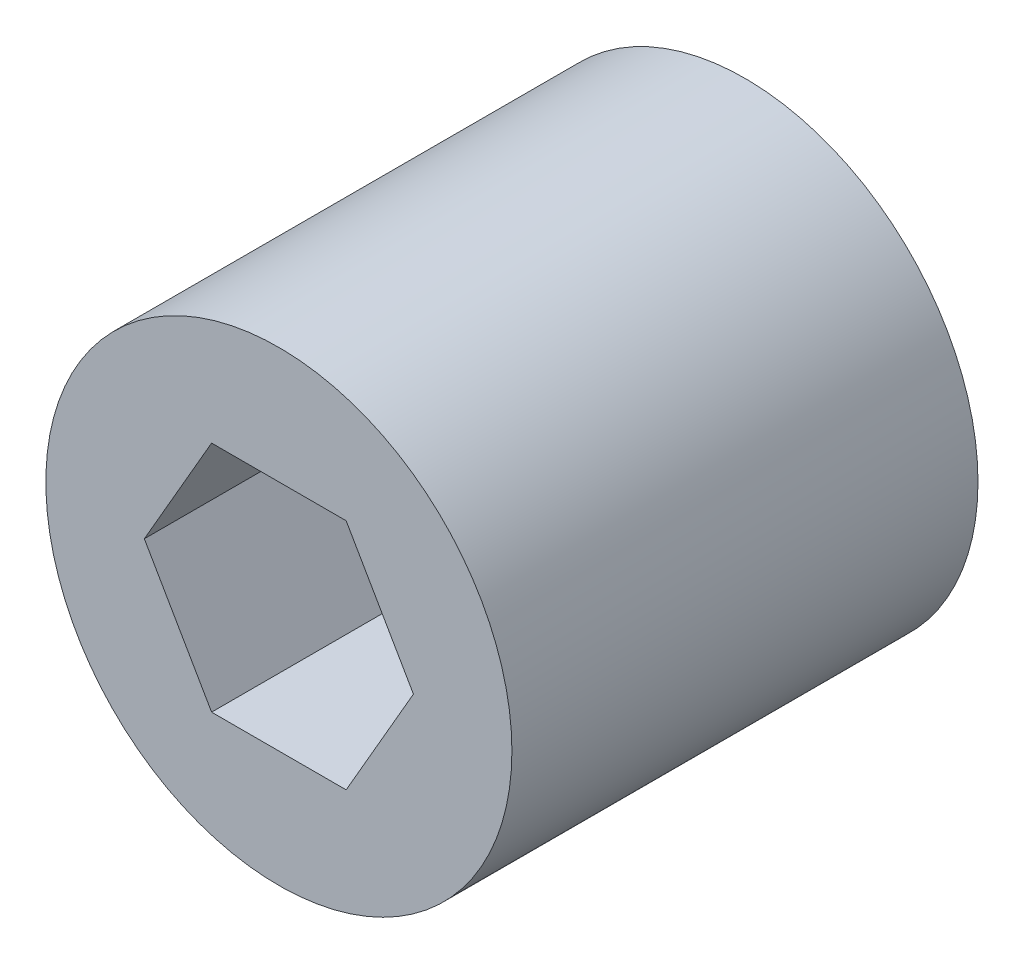
ISO-10303-21;
HEADER;
FILE_DESCRIPTION(('STEP AP214'),'2;1');
FILE_NAME('part.step','',(''),(''),'','','');
FILE_SCHEMA(('AUTOMOTIVE_DESIGN { 1 0 10303 214 1 1 1 1 }'));
ENDSEC;
DATA;
#1=APPLICATION_CONTEXT('core data for automotive mechanical design processes');
#2=APPLICATION_PROTOCOL_DEFINITION('international standard','automotive_design',2000,#1);
#3=PRODUCT_CONTEXT('',#1,'mechanical');
#4=PRODUCT('Part','Part','',(#3));
#5=PRODUCT_RELATED_PRODUCT_CATEGORY('part','',(#4));
#6=PRODUCT_DEFINITION_FORMATION('','',#4);
#7=PRODUCT_DEFINITION_CONTEXT('part definition',#1,'design');
#8=PRODUCT_DEFINITION('design','',#6,#7);
#9=PRODUCT_DEFINITION_SHAPE('','',#8);
#10=(LENGTH_UNIT() NAMED_UNIT(*) SI_UNIT(.MILLI.,.METRE.));
#11=(NAMED_UNIT(*) PLANE_ANGLE_UNIT() SI_UNIT($,.RADIAN.));
#12=(NAMED_UNIT(*) SI_UNIT($,.STERADIAN.) SOLID_ANGLE_UNIT());
#13=UNCERTAINTY_MEASURE_WITH_UNIT(LENGTH_MEASURE(1.E-05),#10,'distance_accuracy_value','');
#14=(GEOMETRIC_REPRESENTATION_CONTEXT(3) GLOBAL_UNCERTAINTY_ASSIGNED_CONTEXT((#13)) GLOBAL_UNIT_ASSIGNED_CONTEXT((#10,
#11,#12)) REPRESENTATION_CONTEXT('',''));
#15=CARTESIAN_POINT('',(0.,0.,0.));
#16=DIRECTION('',(0.,0.,1.));
#17=DIRECTION('',(1.,0.,0.));
#18=AXIS2_PLACEMENT_3D('',#15,#16,#17);
#19=CARTESIAN_POINT('',(0.,0.,4.));
#20=DIRECTION('',(0.,0.,1.));
#21=DIRECTION('',(1.,0.,0.));
#22=AXIS2_PLACEMENT_3D('',#19,#20,#21);
#23=PLANE('',#22);
#24=CARTESIAN_POINT('',(0.,0.,4.));
#25=DIRECTION('',(0.,0.,1.));
#26=DIRECTION('',(1.,0.,0.));
#27=AXIS2_PLACEMENT_3D('',#24,#25,#26);
#28=CIRCLE('',#27,1.5);
#29=CARTESIAN_POINT('',(1.5,0.,4.));
#30=VERTEX_POINT('',#29);
#31=EDGE_CURVE('E100',#30,#30,#28,.T.);
#32=ORIENTED_EDGE('',*,*,#31,.T.);
#33=EDGE_LOOP('',(#32));
#34=FACE_BOUND('',#33,.T.);
#35=DIRECTION('',(0.5,-0.866025403784439,0.));
#36=VECTOR('',#35,1.);
#37=CARTESIAN_POINT('',(0.649519052838329,0.375,4.));
#38=LINE('',#37,#36);
#39=CARTESIAN_POINT('',(0.433012701892219,0.75,4.));
#40=VERTEX_POINT('',#39);
#41=CARTESIAN_POINT('',(0.866025403784439,0.,4.));
#42=VERTEX_POINT('',#41);
#43=EDGE_CURVE('E48',#40,#42,#38,.T.);
#44=ORIENTED_EDGE('',*,*,#43,.T.);
#45=DIRECTION('',(-0.5,-0.866025403784439,0.));
#46=VECTOR('',#45,1.);
#47=CARTESIAN_POINT('',(0.649519052838329,-0.375,4.));
#48=LINE('',#47,#46);
#49=CARTESIAN_POINT('',(0.433012701892219,-0.75,4.));
#50=VERTEX_POINT('',#49);
#51=EDGE_CURVE('E11',#42,#50,#48,.T.);
#52=ORIENTED_EDGE('',*,*,#51,.T.);
#53=DIRECTION('',(-1.,0.,0.));
#54=VECTOR('',#53,1.);
#55=CARTESIAN_POINT('',(0.,-0.75,4.));
#56=LINE('',#55,#54);
#57=CARTESIAN_POINT('',(-0.43301270189222,-0.75,4.));
#58=VERTEX_POINT('',#57);
#59=EDGE_CURVE('E135',#50,#58,#56,.T.);
#60=ORIENTED_EDGE('',*,*,#59,.T.);
#61=DIRECTION('',(-0.5,0.866025403784439,0.));
#62=VECTOR('',#61,1.);
#63=CARTESIAN_POINT('',(-0.649519052838329,-0.375,4.));
#64=LINE('',#63,#62);
#65=CARTESIAN_POINT('',(-0.866025403784439,0.,4.));
#66=VERTEX_POINT('',#65);
#67=EDGE_CURVE('E138',#58,#66,#64,.T.);
#68=ORIENTED_EDGE('',*,*,#67,.T.);
#69=DIRECTION('',(0.5,0.866025403784439,0.));
#70=VECTOR('',#69,1.);
#71=CARTESIAN_POINT('',(-0.649519052838329,0.375,4.));
#72=LINE('',#71,#70);
#73=CARTESIAN_POINT('',(-0.433012701892219,0.75,4.));
#74=VERTEX_POINT('',#73);
#75=EDGE_CURVE('E140',#66,#74,#72,.T.);
#76=ORIENTED_EDGE('',*,*,#75,.T.);
#77=DIRECTION('',(1.,0.,0.));
#78=VECTOR('',#77,1.);
#79=CARTESIAN_POINT('',(0.,0.75,4.));
#80=LINE('',#79,#78);
#81=EDGE_CURVE('E142',#74,#40,#80,.T.);
#82=ORIENTED_EDGE('',*,*,#81,.T.);
#83=EDGE_LOOP('',(#44,#52,#60,#68,#76,#82));
#84=FACE_BOUND('',#83,.T.);
#85=ADVANCED_FACE('F39',(#34,#84),#23,.T.);
#86=CARTESIAN_POINT('',(0.,0.,4.));
#87=DIRECTION('',(0.,0.,-1.));
#88=DIRECTION('',(-1.,0.,0.));
#89=AXIS2_PLACEMENT_3D('',#86,#87,#88);
#90=CYLINDRICAL_SURFACE('',#89,1.5);
#91=CARTESIAN_POINT('',(0.,0.,1.));
#92=DIRECTION('',(0.,0.,1.));
#93=DIRECTION('',(1.,0.,0.));
#94=AXIS2_PLACEMENT_3D('',#91,#92,#93);
#95=CIRCLE('',#94,1.5);
#96=CARTESIAN_POINT('',(1.5,0.,1.));
#97=VERTEX_POINT('',#96);
#98=EDGE_CURVE('E43',#97,#97,#95,.T.);
#99=ORIENTED_EDGE('',*,*,#98,.T.);
#100=EDGE_LOOP('',(#99));
#101=FACE_BOUND('',#100,.T.);
#102=ORIENTED_EDGE('',*,*,#31,.F.);
#103=EDGE_LOOP('',(#102));
#104=FACE_BOUND('',#103,.T.);
#105=ADVANCED_FACE('F41',(#101,#104),#90,.T.);
#106=CARTESIAN_POINT('',(0.433012701892219,-0.75,4.1));
#107=DIRECTION('',(-0.866025403784439,0.5,0.));
#108=DIRECTION('',(-0.5,-0.866025403784439,0.));
#109=AXIS2_PLACEMENT_3D('',#106,#107,#108);
#110=PLANE('',#109);
#111=DIRECTION('',(0.,0.,-1.));
#112=VECTOR('',#111,1.);
#113=CARTESIAN_POINT('',(0.866025403784439,0.,4.1));
#114=LINE('',#113,#112);
#115=CARTESIAN_POINT('',(0.866025403784439,0.,2.8));
#116=VERTEX_POINT('',#115);
#117=EDGE_CURVE('E89',#42,#116,#114,.T.);
#118=ORIENTED_EDGE('',*,*,#117,.T.);
#119=DIRECTION('',(0.5,0.866025403784439,0.));
#120=VECTOR('',#119,1.);
#121=CARTESIAN_POINT('',(0.433012701892219,-0.75,2.8));
#122=LINE('',#121,#120);
#123=CARTESIAN_POINT('',(0.433012701892219,-0.75,2.8));
#124=VERTEX_POINT('',#123);
#125=EDGE_CURVE('E94',#124,#116,#122,.T.);
#126=ORIENTED_EDGE('',*,*,#125,.F.);
#127=DIRECTION('',(0.,0.,-1.));
#128=VECTOR('',#127,1.);
#129=CARTESIAN_POINT('',(0.433012701892219,-0.75,4.1));
#130=LINE('',#129,#128);
#131=EDGE_CURVE('E122',#50,#124,#130,.T.);
#132=ORIENTED_EDGE('',*,*,#131,.F.);
#133=ORIENTED_EDGE('',*,*,#51,.F.);
#134=EDGE_LOOP('',(#118,#126,#132,#133));
#135=FACE_BOUND('',#134,.T.);
#136=ADVANCED_FACE('F95',(#135),#110,.T.);
#137=CARTESIAN_POINT('',(0.866025403784439,0.,4.1));
#138=DIRECTION('',(-0.866025403784439,-0.5,0.));
#139=DIRECTION('',(0.5,-0.866025403784439,0.));
#140=AXIS2_PLACEMENT_3D('',#137,#138,#139);
#141=PLANE('',#140);
#142=DIRECTION('',(0.,0.,-1.));
#143=VECTOR('',#142,1.);
#144=CARTESIAN_POINT('',(0.433012701892219,0.75,4.1));
#145=LINE('',#144,#143);
#146=CARTESIAN_POINT('',(0.433012701892219,0.75,2.8));
#147=VERTEX_POINT('',#146);
#148=EDGE_CURVE('E98',#40,#147,#145,.T.);
#149=ORIENTED_EDGE('',*,*,#148,.T.);
#150=DIRECTION('',(-0.5,0.866025403784439,0.));
#151=VECTOR('',#150,1.);
#152=CARTESIAN_POINT('',(0.866025403784439,0.,2.8));
#153=LINE('',#152,#151);
#154=EDGE_CURVE('E101',#116,#147,#153,.T.);
#155=ORIENTED_EDGE('',*,*,#154,.F.);
#156=ORIENTED_EDGE('',*,*,#117,.F.);
#157=ORIENTED_EDGE('',*,*,#43,.F.);
#158=EDGE_LOOP('',(#149,#155,#156,#157));
#159=FACE_BOUND('',#158,.T.);
#160=ADVANCED_FACE('F105',(#159),#141,.T.);
#161=CARTESIAN_POINT('',(0.433012701892219,0.75,4.1));
#162=DIRECTION('',(0.,-1.,0.));
#163=DIRECTION('',(1.,0.,0.));
#164=AXIS2_PLACEMENT_3D('',#161,#162,#163);
#165=PLANE('',#164);
#166=DIRECTION('',(0.,0.,-1.));
#167=VECTOR('',#166,1.);
#168=CARTESIAN_POINT('',(-0.433012701892219,0.75,4.1));
#169=LINE('',#168,#167);
#170=CARTESIAN_POINT('',(-0.433012701892219,0.75,2.8));
#171=VERTEX_POINT('',#170);
#172=EDGE_CURVE('E126',#74,#171,#169,.T.);
#173=ORIENTED_EDGE('',*,*,#172,.T.);
#174=DIRECTION('',(-1.,0.,0.));
#175=VECTOR('',#174,1.);
#176=CARTESIAN_POINT('',(0.433012701892219,0.75,2.8));
#177=LINE('',#176,#175);
#178=EDGE_CURVE('E110',#147,#171,#177,.T.);
#179=ORIENTED_EDGE('',*,*,#178,.F.);
#180=ORIENTED_EDGE('',*,*,#148,.F.);
#181=ORIENTED_EDGE('',*,*,#81,.F.);
#182=EDGE_LOOP('',(#173,#179,#180,#181));
#183=FACE_BOUND('',#182,.T.);
#184=ADVANCED_FACE('F150',(#183),#165,.T.);
#185=CARTESIAN_POINT('',(-0.433012701892219,0.75,4.1));
#186=DIRECTION('',(0.866025403784439,-0.5,0.));
#187=DIRECTION('',(0.5,0.866025403784439,0.));
#188=AXIS2_PLACEMENT_3D('',#185,#186,#187);
#189=PLANE('',#188);
#190=DIRECTION('',(0.,0.,-1.));
#191=VECTOR('',#190,1.);
#192=CARTESIAN_POINT('',(-0.866025403784439,0.,4.1));
#193=LINE('',#192,#191);
#194=CARTESIAN_POINT('',(-0.866025403784439,0.,2.8));
#195=VERTEX_POINT('',#194);
#196=EDGE_CURVE('E127',#66,#195,#193,.T.);
#197=ORIENTED_EDGE('',*,*,#196,.T.);
#198=DIRECTION('',(-0.5,-0.866025403784439,0.));
#199=VECTOR('',#198,1.);
#200=CARTESIAN_POINT('',(-0.433012701892219,0.75,2.8));
#201=LINE('',#200,#199);
#202=EDGE_CURVE('E119',#171,#195,#201,.T.);
#203=ORIENTED_EDGE('',*,*,#202,.F.);
#204=ORIENTED_EDGE('',*,*,#172,.F.);
#205=ORIENTED_EDGE('',*,*,#75,.F.);
#206=EDGE_LOOP('',(#197,#203,#204,#205));
#207=FACE_BOUND('',#206,.T.);
#208=ADVANCED_FACE('F155',(#207),#189,.T.);
#209=CARTESIAN_POINT('',(-0.866025403784439,0.,4.1));
#210=DIRECTION('',(0.866025403784439,0.5,0.));
#211=DIRECTION('',(-0.5,0.866025403784439,0.));
#212=AXIS2_PLACEMENT_3D('',#209,#210,#211);
#213=PLANE('',#212);
#214=DIRECTION('',(0.,0.,-1.));
#215=VECTOR('',#214,1.);
#216=CARTESIAN_POINT('',(-0.43301270189222,-0.75,4.1));
#217=LINE('',#216,#215);
#218=CARTESIAN_POINT('',(-0.43301270189222,-0.75,2.8));
#219=VERTEX_POINT('',#218);
#220=EDGE_CURVE('E54',#58,#219,#217,.T.);
#221=ORIENTED_EDGE('',*,*,#220,.T.);
#222=DIRECTION('',(0.5,-0.866025403784439,0.));
#223=VECTOR('',#222,1.);
#224=CARTESIAN_POINT('',(-0.866025403784439,0.,2.8));
#225=LINE('',#224,#223);
#226=EDGE_CURVE('E118',#195,#219,#225,.T.);
#227=ORIENTED_EDGE('',*,*,#226,.F.);
#228=ORIENTED_EDGE('',*,*,#196,.F.);
#229=ORIENTED_EDGE('',*,*,#67,.F.);
#230=EDGE_LOOP('',(#221,#227,#228,#229));
#231=FACE_BOUND('',#230,.T.);
#232=ADVANCED_FACE('F154',(#231),#213,.T.);
#233=CARTESIAN_POINT('',(-0.43301270189222,-0.75,4.1));
#234=DIRECTION('',(0.,1.,0.));
#235=DIRECTION('',(-1.,0.,0.));
#236=AXIS2_PLACEMENT_3D('',#233,#234,#235);
#237=PLANE('',#236);
#238=ORIENTED_EDGE('',*,*,#131,.T.);
#239=DIRECTION('',(1.,0.,0.));
#240=VECTOR('',#239,1.);
#241=CARTESIAN_POINT('',(-0.43301270189222,-0.75,2.8));
#242=LINE('',#241,#240);
#243=EDGE_CURVE('E115',#219,#124,#242,.T.);
#244=ORIENTED_EDGE('',*,*,#243,.F.);
#245=ORIENTED_EDGE('',*,*,#220,.F.);
#246=ORIENTED_EDGE('',*,*,#59,.F.);
#247=EDGE_LOOP('',(#238,#244,#245,#246));
#248=FACE_BOUND('',#247,.T.);
#249=ADVANCED_FACE('F156',(#248),#237,.T.);
#250=CARTESIAN_POINT('',(0.,0.,2.8));
#251=DIRECTION('',(0.,0.,1.));
#252=DIRECTION('',(1.,0.,0.));
#253=AXIS2_PLACEMENT_3D('',#250,#251,#252);
#254=PLANE('',#253);
#255=ORIENTED_EDGE('',*,*,#125,.T.);
#256=ORIENTED_EDGE('',*,*,#154,.T.);
#257=ORIENTED_EDGE('',*,*,#178,.T.);
#258=ORIENTED_EDGE('',*,*,#202,.T.);
#259=ORIENTED_EDGE('',*,*,#226,.T.);
#260=ORIENTED_EDGE('',*,*,#243,.T.);
#261=EDGE_LOOP('',(#255,#256,#257,#258,#259,#260));
#262=FACE_BOUND('',#261,.T.);
#263=ADVANCED_FACE('F109',(#262),#254,.T.);
#264=CARTESIAN_POINT('',(0.,0.,1.));
#265=DIRECTION('',(0.,0.,1.));
#266=DIRECTION('',(1.,0.,0.));
#267=AXIS2_PLACEMENT_3D('',#264,#265,#266);
#268=PLANE('',#267);
#269=ORIENTED_EDGE('',*,*,#98,.F.);
#270=EDGE_LOOP('',(#269));
#271=FACE_BOUND('',#270,.T.);
#272=ADVANCED_FACE('F162',(#271),#268,.F.);
#273=CLOSED_SHELL('',(#85,#105,#136,#160,#184,#208,#232,#249,#263,#272));
#274=MANIFOLD_SOLID_BREP('B2',#273);
#275=ADVANCED_BREP_SHAPE_REPRESENTATION('',(#18,#274),#14);
#276=SHAPE_DEFINITION_REPRESENTATION(#9,#275);
ENDSEC;
END-ISO-10303-21;
